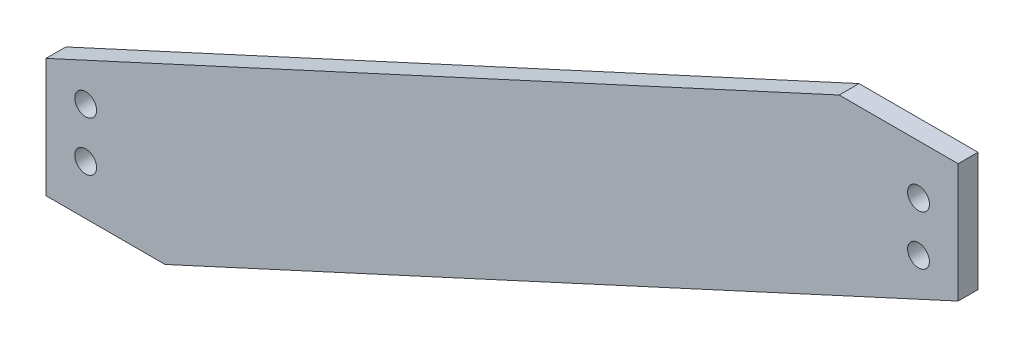
ISO-10303-21;
HEADER;
FILE_DESCRIPTION(('STEP AP214'),'2;1');
FILE_NAME('part.step','',(''),(''),'','','');
FILE_SCHEMA(('AUTOMOTIVE_DESIGN { 1 0 10303 214 1 1 1 1 }'));
ENDSEC;
DATA;
#1=APPLICATION_CONTEXT('core data for automotive mechanical design processes');
#2=APPLICATION_PROTOCOL_DEFINITION('international standard','automotive_design',2000,#1);
#3=PRODUCT_CONTEXT('',#1,'mechanical');
#4=PRODUCT('Part','Part','',(#3));
#5=PRODUCT_RELATED_PRODUCT_CATEGORY('part','',(#4));
#6=PRODUCT_DEFINITION_FORMATION('','',#4);
#7=PRODUCT_DEFINITION_CONTEXT('part definition',#1,'design');
#8=PRODUCT_DEFINITION('design','',#6,#7);
#9=PRODUCT_DEFINITION_SHAPE('','',#8);
#10=(LENGTH_UNIT() NAMED_UNIT(*) SI_UNIT(.MILLI.,.METRE.));
#11=(NAMED_UNIT(*) PLANE_ANGLE_UNIT() SI_UNIT($,.RADIAN.));
#12=(NAMED_UNIT(*) SI_UNIT($,.STERADIAN.) SOLID_ANGLE_UNIT());
#13=UNCERTAINTY_MEASURE_WITH_UNIT(LENGTH_MEASURE(1.E-05),#10,'distance_accuracy_value','');
#14=(GEOMETRIC_REPRESENTATION_CONTEXT(3) GLOBAL_UNCERTAINTY_ASSIGNED_CONTEXT((#13)) GLOBAL_UNIT_ASSIGNED_CONTEXT((#10,
#11,#12)) REPRESENTATION_CONTEXT('',''));
#15=CARTESIAN_POINT('',(0.,0.,0.));
#16=DIRECTION('',(0.,0.,1.));
#17=DIRECTION('',(1.,0.,0.));
#18=AXIS2_PLACEMENT_3D('',#15,#16,#17);
#19=CARTESIAN_POINT('',(0.,0.,-260.353605698097));
#20=DIRECTION('',(-1.,0.,0.));
#21=DIRECTION('',(0.,0.,1.));
#22=AXIS2_PLACEMENT_3D('',#19,#20,#21);
#23=PLANE('',#22);
#24=DIRECTION('',(0.,1.,0.));
#25=VECTOR('',#24,1.);
#26=CARTESIAN_POINT('',(0.,0.,0.));
#27=LINE('',#26,#25);
#28=CARTESIAN_POINT('',(0.,0.,0.));
#29=VERTEX_POINT('',#28);
#30=CARTESIAN_POINT('',(0.,30.,0.));
#31=VERTEX_POINT('',#30);
#32=EDGE_CURVE('E63',#29,#31,#27,.T.);
#33=ORIENTED_EDGE('',*,*,#32,.F.);
#34=DIRECTION('',(0.,0.,-1.));
#35=VECTOR('',#34,1.);
#36=CARTESIAN_POINT('',(0.,0.,5.));
#37=LINE('',#36,#35);
#38=CARTESIAN_POINT('',(0.,0.,5.));
#39=VERTEX_POINT('',#38);
#40=EDGE_CURVE('E11',#39,#29,#37,.T.);
#41=ORIENTED_EDGE('',*,*,#40,.F.);
#42=DIRECTION('',(0.,-1.,0.));
#43=VECTOR('',#42,1.);
#44=CARTESIAN_POINT('',(0.,0.,5.));
#45=LINE('',#44,#43);
#46=CARTESIAN_POINT('',(0.,30.,5.));
#47=VERTEX_POINT('',#46);
#48=EDGE_CURVE('E102',#47,#39,#45,.T.);
#49=ORIENTED_EDGE('',*,*,#48,.F.);
#50=DIRECTION('',(0.,0.,1.));
#51=VECTOR('',#50,1.);
#52=CARTESIAN_POINT('',(0.,30.,-260.353605698097));
#53=LINE('',#52,#51);
#54=EDGE_CURVE('E137',#31,#47,#53,.T.);
#55=ORIENTED_EDGE('',*,*,#54,.F.);
#56=EDGE_LOOP('',(#33,#41,#49,#55));
#57=FACE_BOUND('',#56,.T.);
#58=ADVANCED_FACE('F39',(#57),#23,.T.);
#59=CARTESIAN_POINT('',(0.,30.,-260.353605698097));
#60=DIRECTION('',(-0.417905608232144,0.908490452678575,0.));
#61=DIRECTION('',(-0.908490452678575,-0.417905608232144,0.));
#62=AXIS2_PLACEMENT_3D('',#59,#60,#61);
#63=PLANE('',#62);
#64=DIRECTION('',(0.908490452678575,0.417905608232144,0.));
#65=VECTOR('',#64,1.);
#66=CARTESIAN_POINT('',(0.,30.,0.));
#67=LINE('',#66,#65);
#68=CARTESIAN_POINT('',(200.,122.,0.));
#69=VERTEX_POINT('',#68);
#70=EDGE_CURVE('E163',#31,#69,#67,.T.);
#71=ORIENTED_EDGE('',*,*,#70,.F.);
#72=ORIENTED_EDGE('',*,*,#54,.T.);
#73=DIRECTION('',(-0.908490452678575,-0.417905608232144,0.));
#74=VECTOR('',#73,1.);
#75=CARTESIAN_POINT('',(0.,30.,5.));
#76=LINE('',#75,#74);
#77=CARTESIAN_POINT('',(200.,122.,5.));
#78=VERTEX_POINT('',#77);
#79=EDGE_CURVE('E125',#78,#47,#76,.T.);
#80=ORIENTED_EDGE('',*,*,#79,.F.);
#81=DIRECTION('',(0.,0.,1.));
#82=VECTOR('',#81,1.);
#83=CARTESIAN_POINT('',(200.,122.,-260.353605698097));
#84=LINE('',#83,#82);
#85=EDGE_CURVE('E140',#69,#78,#84,.T.);
#86=ORIENTED_EDGE('',*,*,#85,.F.);
#87=EDGE_LOOP('',(#71,#72,#80,#86));
#88=FACE_BOUND('',#87,.T.);
#89=ADVANCED_FACE('F168',(#88),#63,.T.);
#90=CARTESIAN_POINT('',(0.,0.,5.));
#91=DIRECTION('',(0.,1.,0.));
#92=DIRECTION('',(0.,0.,1.));
#93=AXIS2_PLACEMENT_3D('',#90,#91,#92);
#94=PLANE('',#93);
#95=DIRECTION('',(1.,0.,0.));
#96=VECTOR('',#95,1.);
#97=CARTESIAN_POINT('',(0.,0.,0.));
#98=LINE('',#97,#96);
#99=CARTESIAN_POINT('',(30.0000000000001,0.,0.));
#100=VERTEX_POINT('',#99);
#101=EDGE_CURVE('E110',#29,#100,#98,.T.);
#102=ORIENTED_EDGE('',*,*,#101,.T.);
#103=DIRECTION('',(0.,0.,1.));
#104=VECTOR('',#103,1.);
#105=CARTESIAN_POINT('',(30.0000000000001,0.,-260.353605698097));
#106=LINE('',#105,#104);
#107=CARTESIAN_POINT('',(30.0000000000001,0.,5.));
#108=VERTEX_POINT('',#107);
#109=EDGE_CURVE('E109',#100,#108,#106,.T.);
#110=ORIENTED_EDGE('',*,*,#109,.T.);
#111=DIRECTION('',(1.,0.,0.));
#112=VECTOR('',#111,1.);
#113=CARTESIAN_POINT('',(0.,0.,5.));
#114=LINE('',#113,#112);
#115=EDGE_CURVE('E94',#39,#108,#114,.T.);
#116=ORIENTED_EDGE('',*,*,#115,.F.);
#117=ORIENTED_EDGE('',*,*,#40,.T.);
#118=EDGE_LOOP('',(#102,#110,#116,#117));
#119=FACE_BOUND('',#118,.T.);
#120=ADVANCED_FACE('F41',(#119),#94,.F.);
#121=CARTESIAN_POINT('',(230.,122.,5.));
#122=DIRECTION('',(0.,-1.,0.));
#123=DIRECTION('',(0.,0.,-1.));
#124=AXIS2_PLACEMENT_3D('',#121,#122,#123);
#125=PLANE('',#124);
#126=DIRECTION('',(-1.,0.,0.));
#127=VECTOR('',#126,1.);
#128=CARTESIAN_POINT('',(230.,122.,0.));
#129=LINE('',#128,#127);
#130=CARTESIAN_POINT('',(230.,122.,0.));
#131=VERTEX_POINT('',#130);
#132=EDGE_CURVE('E106',#131,#69,#129,.T.);
#133=ORIENTED_EDGE('',*,*,#132,.T.);
#134=ORIENTED_EDGE('',*,*,#85,.T.);
#135=DIRECTION('',(-1.,0.,0.));
#136=VECTOR('',#135,1.);
#137=CARTESIAN_POINT('',(230.,122.,5.));
#138=LINE('',#137,#136);
#139=CARTESIAN_POINT('',(230.,122.,5.));
#140=VERTEX_POINT('',#139);
#141=EDGE_CURVE('E105',#140,#78,#138,.T.);
#142=ORIENTED_EDGE('',*,*,#141,.F.);
#143=DIRECTION('',(0.,0.,-1.));
#144=VECTOR('',#143,1.);
#145=CARTESIAN_POINT('',(230.,122.,5.));
#146=LINE('',#145,#144);
#147=EDGE_CURVE('E48',#140,#131,#146,.T.);
#148=ORIENTED_EDGE('',*,*,#147,.T.);
#149=EDGE_LOOP('',(#133,#134,#142,#148));
#150=FACE_BOUND('',#149,.T.);
#151=ADVANCED_FACE('F158',(#150),#125,.F.);
#152=CARTESIAN_POINT('',(0.,0.,5.));
#153=DIRECTION('',(0.,0.,1.));
#154=DIRECTION('',(1.,0.,0.));
#155=AXIS2_PLACEMENT_3D('',#152,#153,#154);
#156=PLANE('',#155);
#157=CARTESIAN_POINT('',(10.,25.,5.));
#158=DIRECTION('',(0.,0.,1.));
#159=DIRECTION('',(1.,0.,0.));
#160=AXIS2_PLACEMENT_3D('',#157,#158,#159);
#161=CIRCLE('',#160,2.74999999999999);
#162=CARTESIAN_POINT('',(12.75,25.,5.));
#163=VERTEX_POINT('',#162);
#164=EDGE_CURVE('E295',#163,#163,#161,.T.);
#165=ORIENTED_EDGE('',*,*,#164,.F.);
#166=EDGE_LOOP('',(#165));
#167=FACE_BOUND('',#166,.T.);
#168=CARTESIAN_POINT('',(220.,97.,5.));
#169=DIRECTION('',(0.,0.,1.));
#170=DIRECTION('',(1.,0.,0.));
#171=AXIS2_PLACEMENT_3D('',#168,#169,#170);
#172=CIRCLE('',#171,2.74999999999997);
#173=CARTESIAN_POINT('',(222.75,97.,5.));
#174=VERTEX_POINT('',#173);
#175=EDGE_CURVE('E299',#174,#174,#172,.T.);
#176=ORIENTED_EDGE('',*,*,#175,.F.);
#177=EDGE_LOOP('',(#176));
#178=FACE_BOUND('',#177,.T.);
#179=CARTESIAN_POINT('',(10.,12.5,5.));
#180=DIRECTION('',(0.,0.,1.));
#181=DIRECTION('',(1.,0.,0.));
#182=AXIS2_PLACEMENT_3D('',#179,#180,#181);
#183=CIRCLE('',#182,2.74999999999999);
#184=CARTESIAN_POINT('',(12.75,12.5,5.));
#185=VERTEX_POINT('',#184);
#186=EDGE_CURVE('E309',#185,#185,#183,.T.);
#187=ORIENTED_EDGE('',*,*,#186,.F.);
#188=EDGE_LOOP('',(#187));
#189=FACE_BOUND('',#188,.T.);
#190=CARTESIAN_POINT('',(220.,109.5,5.));
#191=DIRECTION('',(0.,0.,1.));
#192=DIRECTION('',(1.,0.,0.));
#193=AXIS2_PLACEMENT_3D('',#190,#191,#192);
#194=CIRCLE('',#193,2.74999999999997);
#195=CARTESIAN_POINT('',(222.75,109.5,5.));
#196=VERTEX_POINT('',#195);
#197=EDGE_CURVE('E128',#196,#196,#194,.T.);
#198=ORIENTED_EDGE('',*,*,#197,.F.);
#199=EDGE_LOOP('',(#198));
#200=FACE_BOUND('',#199,.T.);
#201=ORIENTED_EDGE('',*,*,#141,.T.);
#202=ORIENTED_EDGE('',*,*,#79,.T.);
#203=ORIENTED_EDGE('',*,*,#48,.T.);
#204=ORIENTED_EDGE('',*,*,#115,.T.);
#205=DIRECTION('',(0.908490452678575,0.417905608232145,0.));
#206=VECTOR('',#205,1.);
#207=CARTESIAN_POINT('',(230.,92.,5.));
#208=LINE('',#207,#206);
#209=CARTESIAN_POINT('',(230.,92.,5.));
#210=VERTEX_POINT('',#209);
#211=EDGE_CURVE('E99',#108,#210,#208,.T.);
#212=ORIENTED_EDGE('',*,*,#211,.T.);
#213=DIRECTION('',(0.,1.,0.));
#214=VECTOR('',#213,1.);
#215=CARTESIAN_POINT('',(230.,122.,5.));
#216=LINE('',#215,#214);
#217=EDGE_CURVE('E120',#210,#140,#216,.T.);
#218=ORIENTED_EDGE('',*,*,#217,.T.);
#219=EDGE_LOOP('',(#201,#202,#203,#204,#212,#218));
#220=FACE_BOUND('',#219,.T.);
#221=ADVANCED_FACE('F96',(#167,#178,#189,#200,#220),#156,.T.);
#222=CARTESIAN_POINT('',(0.,0.,0.));
#223=DIRECTION('',(0.,0.,1.));
#224=DIRECTION('',(1.,0.,0.));
#225=AXIS2_PLACEMENT_3D('',#222,#223,#224);
#226=PLANE('',#225);
#227=CARTESIAN_POINT('',(10.,25.,0.));
#228=DIRECTION('',(0.,0.,1.));
#229=DIRECTION('',(1.,0.,0.));
#230=AXIS2_PLACEMENT_3D('',#227,#228,#229);
#231=CIRCLE('',#230,2.75);
#232=CARTESIAN_POINT('',(12.75,25.,0.));
#233=VERTEX_POINT('',#232);
#234=EDGE_CURVE('E292',#233,#233,#231,.T.);
#235=ORIENTED_EDGE('',*,*,#234,.T.);
#236=EDGE_LOOP('',(#235));
#237=FACE_BOUND('',#236,.T.);
#238=CARTESIAN_POINT('',(220.,97.,0.));
#239=DIRECTION('',(0.,0.,1.));
#240=DIRECTION('',(1.,0.,0.));
#241=AXIS2_PLACEMENT_3D('',#238,#239,#240);
#242=CIRCLE('',#241,2.75);
#243=CARTESIAN_POINT('',(222.75,97.,0.));
#244=VERTEX_POINT('',#243);
#245=EDGE_CURVE('E305',#244,#244,#242,.T.);
#246=ORIENTED_EDGE('',*,*,#245,.T.);
#247=EDGE_LOOP('',(#246));
#248=FACE_BOUND('',#247,.T.);
#249=CARTESIAN_POINT('',(10.,12.5,0.));
#250=DIRECTION('',(0.,0.,1.));
#251=DIRECTION('',(1.,0.,0.));
#252=AXIS2_PLACEMENT_3D('',#249,#250,#251);
#253=CIRCLE('',#252,2.75);
#254=CARTESIAN_POINT('',(12.75,12.5,0.));
#255=VERTEX_POINT('',#254);
#256=EDGE_CURVE('E313',#255,#255,#253,.T.);
#257=ORIENTED_EDGE('',*,*,#256,.T.);
#258=EDGE_LOOP('',(#257));
#259=FACE_BOUND('',#258,.T.);
#260=CARTESIAN_POINT('',(220.,109.5,0.));
#261=DIRECTION('',(0.,0.,1.));
#262=DIRECTION('',(1.,0.,0.));
#263=AXIS2_PLACEMENT_3D('',#260,#261,#262);
#264=CIRCLE('',#263,2.75);
#265=CARTESIAN_POINT('',(222.75,109.5,0.));
#266=VERTEX_POINT('',#265);
#267=EDGE_CURVE('E121',#266,#266,#264,.T.);
#268=ORIENTED_EDGE('',*,*,#267,.T.);
#269=EDGE_LOOP('',(#268));
#270=FACE_BOUND('',#269,.T.);
#271=ORIENTED_EDGE('',*,*,#101,.F.);
#272=ORIENTED_EDGE('',*,*,#32,.T.);
#273=ORIENTED_EDGE('',*,*,#70,.T.);
#274=ORIENTED_EDGE('',*,*,#132,.F.);
#275=DIRECTION('',(0.,-1.,0.));
#276=VECTOR('',#275,1.);
#277=CARTESIAN_POINT('',(230.,122.,0.));
#278=LINE('',#277,#276);
#279=CARTESIAN_POINT('',(230.,92.,0.));
#280=VERTEX_POINT('',#279);
#281=EDGE_CURVE('E55',#131,#280,#278,.T.);
#282=ORIENTED_EDGE('',*,*,#281,.T.);
#283=DIRECTION('',(-0.908490452678575,-0.417905608232145,0.));
#284=VECTOR('',#283,1.);
#285=CARTESIAN_POINT('',(230.,92.,0.));
#286=LINE('',#285,#284);
#287=EDGE_CURVE('E146',#280,#100,#286,.T.);
#288=ORIENTED_EDGE('',*,*,#287,.T.);
#289=EDGE_LOOP('',(#271,#272,#273,#274,#282,#288));
#290=FACE_BOUND('',#289,.T.);
#291=ADVANCED_FACE('F161',(#237,#248,#259,#270,#290),#226,.F.);
#292=CARTESIAN_POINT('',(230.,92.,-260.353605698097));
#293=DIRECTION('',(0.417905608232145,-0.908490452678575,0.));
#294=DIRECTION('',(0.908490452678575,0.417905608232145,0.));
#295=AXIS2_PLACEMENT_3D('',#292,#293,#294);
#296=PLANE('',#295);
#297=ORIENTED_EDGE('',*,*,#287,.F.);
#298=DIRECTION('',(0.,0.,1.));
#299=VECTOR('',#298,1.);
#300=CARTESIAN_POINT('',(230.,92.,-260.353605698097));
#301=LINE('',#300,#299);
#302=EDGE_CURVE('E115',#280,#210,#301,.T.);
#303=ORIENTED_EDGE('',*,*,#302,.T.);
#304=ORIENTED_EDGE('',*,*,#211,.F.);
#305=ORIENTED_EDGE('',*,*,#109,.F.);
#306=EDGE_LOOP('',(#297,#303,#304,#305));
#307=FACE_BOUND('',#306,.T.);
#308=ADVANCED_FACE('F117',(#307),#296,.T.);
#309=CARTESIAN_POINT('',(230.,122.,-260.353605698097));
#310=DIRECTION('',(1.,0.,0.));
#311=DIRECTION('',(0.,0.,-1.));
#312=AXIS2_PLACEMENT_3D('',#309,#310,#311);
#313=PLANE('',#312);
#314=ORIENTED_EDGE('',*,*,#281,.F.);
#315=ORIENTED_EDGE('',*,*,#147,.F.);
#316=ORIENTED_EDGE('',*,*,#217,.F.);
#317=ORIENTED_EDGE('',*,*,#302,.F.);
#318=EDGE_LOOP('',(#314,#315,#316,#317));
#319=FACE_BOUND('',#318,.T.);
#320=ADVANCED_FACE('F179',(#319),#313,.T.);
#321=CARTESIAN_POINT('',(220.,109.5,5.));
#322=DIRECTION('',(0.,0.,1.));
#323=DIRECTION('',(1.,0.,0.));
#324=AXIS2_PLACEMENT_3D('',#321,#322,#323);
#325=CYLINDRICAL_SURFACE('',#324,2.74999999999999);
#326=ORIENTED_EDGE('',*,*,#267,.F.);
#327=EDGE_LOOP('',(#326));
#328=FACE_BOUND('',#327,.T.);
#329=ORIENTED_EDGE('',*,*,#197,.T.);
#330=EDGE_LOOP('',(#329));
#331=FACE_BOUND('',#330,.T.);
#332=ADVANCED_FACE('F176',(#328,#331),#325,.F.);
#333=CARTESIAN_POINT('',(10.,12.5,5.));
#334=DIRECTION('',(0.,0.,1.));
#335=DIRECTION('',(1.,0.,0.));
#336=AXIS2_PLACEMENT_3D('',#333,#334,#335);
#337=CYLINDRICAL_SURFACE('',#336,2.74999999999999);
#338=ORIENTED_EDGE('',*,*,#256,.F.);
#339=EDGE_LOOP('',(#338));
#340=FACE_BOUND('',#339,.T.);
#341=ORIENTED_EDGE('',*,*,#186,.T.);
#342=EDGE_LOOP('',(#341));
#343=FACE_BOUND('',#342,.T.);
#344=ADVANCED_FACE('F257',(#340,#343),#337,.F.);
#345=CARTESIAN_POINT('',(220.,97.,5.));
#346=DIRECTION('',(0.,0.,1.));
#347=DIRECTION('',(1.,0.,0.));
#348=AXIS2_PLACEMENT_3D('',#345,#346,#347);
#349=CYLINDRICAL_SURFACE('',#348,2.74999999999999);
#350=ORIENTED_EDGE('',*,*,#245,.F.);
#351=EDGE_LOOP('',(#350));
#352=FACE_BOUND('',#351,.T.);
#353=ORIENTED_EDGE('',*,*,#175,.T.);
#354=EDGE_LOOP('',(#353));
#355=FACE_BOUND('',#354,.T.);
#356=ADVANCED_FACE('F266',(#352,#355),#349,.F.);
#357=CARTESIAN_POINT('',(10.,25.,5.));
#358=DIRECTION('',(0.,0.,1.));
#359=DIRECTION('',(1.,0.,0.));
#360=AXIS2_PLACEMENT_3D('',#357,#358,#359);
#361=CYLINDRICAL_SURFACE('',#360,2.74999999999999);
#362=ORIENTED_EDGE('',*,*,#234,.F.);
#363=EDGE_LOOP('',(#362));
#364=FACE_BOUND('',#363,.T.);
#365=ORIENTED_EDGE('',*,*,#164,.T.);
#366=EDGE_LOOP('',(#365));
#367=FACE_BOUND('',#366,.T.);
#368=ADVANCED_FACE('F275',(#364,#367),#361,.F.);
#369=CLOSED_SHELL('',(#58,#89,#120,#151,#221,#291,#308,#320,#332,#344,#356,#368));
#370=MANIFOLD_SOLID_BREP('B2',#369);
#371=ADVANCED_BREP_SHAPE_REPRESENTATION('',(#18,#370),#14);
#372=SHAPE_DEFINITION_REPRESENTATION(#9,#371);
ENDSEC;
END-ISO-10303-21;
